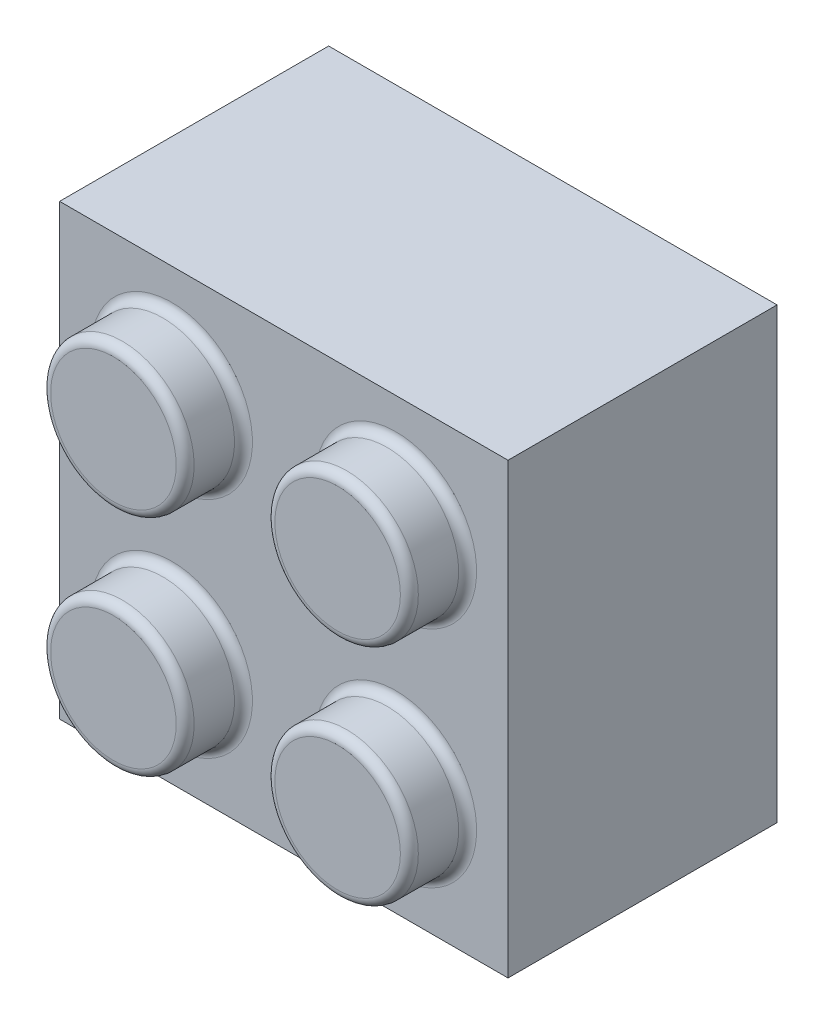
ISO-10303-21;
HEADER;
FILE_DESCRIPTION(('STEP AP214'),'2;1');
FILE_NAME('part.step','',(''),(''),'','','');
FILE_SCHEMA(('AUTOMOTIVE_DESIGN { 1 0 10303 214 1 1 1 1 }'));
ENDSEC;
DATA;
#1=APPLICATION_CONTEXT('core data for automotive mechanical design processes');
#2=APPLICATION_PROTOCOL_DEFINITION('international standard','automotive_design',2000,#1);
#3=PRODUCT_CONTEXT('',#1,'mechanical');
#4=PRODUCT('Part','Part','',(#3));
#5=PRODUCT_RELATED_PRODUCT_CATEGORY('part','',(#4));
#6=PRODUCT_DEFINITION_FORMATION('','',#4);
#7=PRODUCT_DEFINITION_CONTEXT('part definition',#1,'design');
#8=PRODUCT_DEFINITION('design','',#6,#7);
#9=PRODUCT_DEFINITION_SHAPE('','',#8);
#10=(LENGTH_UNIT() NAMED_UNIT(*) SI_UNIT(.MILLI.,.METRE.));
#11=(NAMED_UNIT(*) PLANE_ANGLE_UNIT() SI_UNIT($,.RADIAN.));
#12=(NAMED_UNIT(*) SI_UNIT($,.STERADIAN.) SOLID_ANGLE_UNIT());
#13=UNCERTAINTY_MEASURE_WITH_UNIT(LENGTH_MEASURE(1.E-05),#10,'distance_accuracy_value','');
#14=(GEOMETRIC_REPRESENTATION_CONTEXT(3) GLOBAL_UNCERTAINTY_ASSIGNED_CONTEXT((#13)) GLOBAL_UNIT_ASSIGNED_CONTEXT((#10,
#11,#12)) REPRESENTATION_CONTEXT('',''));
#15=CARTESIAN_POINT('',(0.,0.,0.));
#16=DIRECTION('',(0.,0.,1.));
#17=DIRECTION('',(1.,0.,0.));
#18=AXIS2_PLACEMENT_3D('',#15,#16,#17);
#19=CARTESIAN_POINT('',(0.,0.,0.));
#20=DIRECTION('',(0.,0.,-1.));
#21=DIRECTION('',(-1.,0.,0.));
#22=AXIS2_PLACEMENT_3D('',#19,#20,#21);
#23=PLANE('',#22);
#24=DIRECTION('',(-1.,0.,0.));
#25=VECTOR('',#24,1.);
#26=CARTESIAN_POINT('',(50.,-50.,0.));
#27=LINE('',#26,#25);
#28=CARTESIAN_POINT('',(50.,-50.,0.));
#29=VERTEX_POINT('',#28);
#30=CARTESIAN_POINT('',(-50.,-50.,0.));
#31=VERTEX_POINT('',#30);
#32=EDGE_CURVE('E177',#29,#31,#27,.T.);
#33=ORIENTED_EDGE('',*,*,#32,.T.);
#34=DIRECTION('',(0.,1.,0.));
#35=VECTOR('',#34,1.);
#36=CARTESIAN_POINT('',(-50.,-50.,0.));
#37=LINE('',#36,#35);
#38=CARTESIAN_POINT('',(-50.,50.,0.));
#39=VERTEX_POINT('',#38);
#40=EDGE_CURVE('E200',#31,#39,#37,.T.);
#41=ORIENTED_EDGE('',*,*,#40,.T.);
#42=DIRECTION('',(1.,0.,0.));
#43=VECTOR('',#42,1.);
#44=CARTESIAN_POINT('',(-50.,50.,0.));
#45=LINE('',#44,#43);
#46=CARTESIAN_POINT('',(50.,50.,0.));
#47=VERTEX_POINT('',#46);
#48=EDGE_CURVE('E204',#39,#47,#45,.T.);
#49=ORIENTED_EDGE('',*,*,#48,.T.);
#50=DIRECTION('',(0.,-1.,0.));
#51=VECTOR('',#50,1.);
#52=CARTESIAN_POINT('',(50.,50.,0.));
#53=LINE('',#52,#51);
#54=EDGE_CURVE('E187',#47,#29,#53,.T.);
#55=ORIENTED_EDGE('',*,*,#54,.T.);
#56=EDGE_LOOP('',(#33,#41,#49,#55));
#57=FACE_BOUND('',#56,.T.);
#58=DIRECTION('',(1.,0.,0.));
#59=VECTOR('',#58,1.);
#60=CARTESIAN_POINT('',(0.,-42.,0.));
#61=LINE('',#60,#59);
#62=CARTESIAN_POINT('',(-42.,-42.,0.));
#63=VERTEX_POINT('',#62);
#64=CARTESIAN_POINT('',(42.,-42.,0.));
#65=VERTEX_POINT('',#64);
#66=EDGE_CURVE('E168',#63,#65,#61,.T.);
#67=ORIENTED_EDGE('',*,*,#66,.T.);
#68=DIRECTION('',(0.,1.,0.));
#69=VECTOR('',#68,1.);
#70=CARTESIAN_POINT('',(42.,0.,0.));
#71=LINE('',#70,#69);
#72=CARTESIAN_POINT('',(42.,42.,0.));
#73=VERTEX_POINT('',#72);
#74=EDGE_CURVE('E71',#65,#73,#71,.T.);
#75=ORIENTED_EDGE('',*,*,#74,.T.);
#76=DIRECTION('',(-1.,0.,0.));
#77=VECTOR('',#76,1.);
#78=CARTESIAN_POINT('',(0.,42.,0.));
#79=LINE('',#78,#77);
#80=CARTESIAN_POINT('',(-42.,42.,0.));
#81=VERTEX_POINT('',#80);
#82=EDGE_CURVE('E153',#73,#81,#79,.T.);
#83=ORIENTED_EDGE('',*,*,#82,.T.);
#84=DIRECTION('',(0.,-1.,0.));
#85=VECTOR('',#84,1.);
#86=CARTESIAN_POINT('',(-42.,0.,0.));
#87=LINE('',#86,#85);
#88=EDGE_CURVE('E157',#81,#63,#87,.T.);
#89=ORIENTED_EDGE('',*,*,#88,.T.);
#90=EDGE_LOOP('',(#67,#75,#83,#89));
#91=FACE_BOUND('',#90,.T.);
#92=ADVANCED_FACE('F55',(#57,#91),#23,.T.);
#93=CARTESIAN_POINT('',(50.,-50.,60.));
#94=DIRECTION('',(0.,-1.,0.));
#95=DIRECTION('',(0.,0.,-1.));
#96=AXIS2_PLACEMENT_3D('',#93,#94,#95);
#97=PLANE('',#96);
#98=ORIENTED_EDGE('',*,*,#32,.F.);
#99=DIRECTION('',(0.,0.,-1.));
#100=VECTOR('',#99,1.);
#101=CARTESIAN_POINT('',(50.,-50.,60.));
#102=LINE('',#101,#100);
#103=CARTESIAN_POINT('',(50.,-50.,60.));
#104=VERTEX_POINT('',#103);
#105=EDGE_CURVE('E80',#104,#29,#102,.T.);
#106=ORIENTED_EDGE('',*,*,#105,.F.);
#107=DIRECTION('',(-1.,0.,0.));
#108=VECTOR('',#107,1.);
#109=CARTESIAN_POINT('',(50.,-50.,60.));
#110=LINE('',#109,#108);
#111=CARTESIAN_POINT('',(-50.,-50.,60.));
#112=VERTEX_POINT('',#111);
#113=EDGE_CURVE('E183',#104,#112,#110,.T.);
#114=ORIENTED_EDGE('',*,*,#113,.T.);
#115=DIRECTION('',(0.,0.,-1.));
#116=VECTOR('',#115,1.);
#117=CARTESIAN_POINT('',(-50.,-50.,60.));
#118=LINE('',#117,#116);
#119=EDGE_CURVE('E106',#112,#31,#118,.T.);
#120=ORIENTED_EDGE('',*,*,#119,.T.);
#121=EDGE_LOOP('',(#98,#106,#114,#120));
#122=FACE_BOUND('',#121,.T.);
#123=ADVANCED_FACE('F330',(#122),#97,.T.);
#124=CARTESIAN_POINT('',(50.,50.,60.));
#125=DIRECTION('',(1.,0.,0.));
#126=DIRECTION('',(0.,0.,-1.));
#127=AXIS2_PLACEMENT_3D('',#124,#125,#126);
#128=PLANE('',#127);
#129=ORIENTED_EDGE('',*,*,#54,.F.);
#130=DIRECTION('',(0.,0.,-1.));
#131=VECTOR('',#130,1.);
#132=CARTESIAN_POINT('',(50.,50.,60.));
#133=LINE('',#132,#131);
#134=CARTESIAN_POINT('',(50.,50.,60.));
#135=VERTEX_POINT('',#134);
#136=EDGE_CURVE('E214',#135,#47,#133,.T.);
#137=ORIENTED_EDGE('',*,*,#136,.F.);
#138=DIRECTION('',(0.,-1.,0.));
#139=VECTOR('',#138,1.);
#140=CARTESIAN_POINT('',(50.,50.,60.));
#141=LINE('',#140,#139);
#142=EDGE_CURVE('E194',#135,#104,#141,.T.);
#143=ORIENTED_EDGE('',*,*,#142,.T.);
#144=ORIENTED_EDGE('',*,*,#105,.T.);
#145=EDGE_LOOP('',(#129,#137,#143,#144));
#146=FACE_BOUND('',#145,.T.);
#147=ADVANCED_FACE('F335',(#146),#128,.T.);
#148=CARTESIAN_POINT('',(-50.,50.,60.));
#149=DIRECTION('',(0.,1.,0.));
#150=DIRECTION('',(0.,0.,1.));
#151=AXIS2_PLACEMENT_3D('',#148,#149,#150);
#152=PLANE('',#151);
#153=ORIENTED_EDGE('',*,*,#48,.F.);
#154=DIRECTION('',(0.,0.,-1.));
#155=VECTOR('',#154,1.);
#156=CARTESIAN_POINT('',(-50.,50.,60.));
#157=LINE('',#156,#155);
#158=CARTESIAN_POINT('',(-50.,50.,60.));
#159=VERTEX_POINT('',#158);
#160=EDGE_CURVE('E217',#159,#39,#157,.T.);
#161=ORIENTED_EDGE('',*,*,#160,.F.);
#162=DIRECTION('',(1.,0.,0.));
#163=VECTOR('',#162,1.);
#164=CARTESIAN_POINT('',(-50.,50.,60.));
#165=LINE('',#164,#163);
#166=EDGE_CURVE('E190',#159,#135,#165,.T.);
#167=ORIENTED_EDGE('',*,*,#166,.T.);
#168=ORIENTED_EDGE('',*,*,#136,.T.);
#169=EDGE_LOOP('',(#153,#161,#167,#168));
#170=FACE_BOUND('',#169,.T.);
#171=ADVANCED_FACE('F396',(#170),#152,.T.);
#172=CARTESIAN_POINT('',(-50.,-50.,60.));
#173=DIRECTION('',(-1.,0.,0.));
#174=DIRECTION('',(0.,0.,1.));
#175=AXIS2_PLACEMENT_3D('',#172,#173,#174);
#176=PLANE('',#175);
#177=ORIENTED_EDGE('',*,*,#40,.F.);
#178=ORIENTED_EDGE('',*,*,#119,.F.);
#179=DIRECTION('',(0.,1.,0.));
#180=VECTOR('',#179,1.);
#181=CARTESIAN_POINT('',(-50.,-50.,60.));
#182=LINE('',#181,#180);
#183=EDGE_CURVE('E186',#112,#159,#182,.T.);
#184=ORIENTED_EDGE('',*,*,#183,.T.);
#185=ORIENTED_EDGE('',*,*,#160,.T.);
#186=EDGE_LOOP('',(#177,#178,#184,#185));
#187=FACE_BOUND('',#186,.T.);
#188=ADVANCED_FACE('F390',(#187),#176,.T.);
#189=CARTESIAN_POINT('',(0.,0.,60.));
#190=DIRECTION('',(0.,0.,-1.));
#191=DIRECTION('',(-1.,0.,0.));
#192=AXIS2_PLACEMENT_3D('',#189,#190,#191);
#193=PLANE('',#192);
#194=CARTESIAN_POINT('',(25.,-25.,60.));
#195=DIRECTION('',(0.,0.,-1.));
#196=DIRECTION('',(-1.,0.,0.));
#197=AXIS2_PLACEMENT_3D('',#194,#195,#196);
#198=CIRCLE('',#197,18.);
#199=CARTESIAN_POINT('',(7.00000000000001,-25.,60.));
#200=VERTEX_POINT('',#199);
#201=EDGE_CURVE('E265',#200,#200,#198,.T.);
#202=ORIENTED_EDGE('',*,*,#201,.T.);
#203=EDGE_LOOP('',(#202));
#204=FACE_BOUND('',#203,.T.);
#205=CARTESIAN_POINT('',(-25.,-25.,60.));
#206=DIRECTION('',(0.,0.,-1.));
#207=DIRECTION('',(-1.,0.,0.));
#208=AXIS2_PLACEMENT_3D('',#205,#206,#207);
#209=CIRCLE('',#208,18.);
#210=CARTESIAN_POINT('',(-43.,-25.,60.));
#211=VERTEX_POINT('',#210);
#212=EDGE_CURVE('E261',#211,#211,#209,.T.);
#213=ORIENTED_EDGE('',*,*,#212,.T.);
#214=EDGE_LOOP('',(#213));
#215=FACE_BOUND('',#214,.T.);
#216=CARTESIAN_POINT('',(25.,25.,60.));
#217=DIRECTION('',(0.,0.,-1.));
#218=DIRECTION('',(-1.,0.,0.));
#219=AXIS2_PLACEMENT_3D('',#216,#217,#218);
#220=CIRCLE('',#219,18.);
#221=CARTESIAN_POINT('',(7.,25.,60.));
#222=VERTEX_POINT('',#221);
#223=EDGE_CURVE('E257',#222,#222,#220,.T.);
#224=ORIENTED_EDGE('',*,*,#223,.T.);
#225=EDGE_LOOP('',(#224));
#226=FACE_BOUND('',#225,.T.);
#227=CARTESIAN_POINT('',(-25.,25.,60.));
#228=DIRECTION('',(0.,0.,-1.));
#229=DIRECTION('',(-1.,0.,0.));
#230=AXIS2_PLACEMENT_3D('',#227,#228,#229);
#231=CIRCLE('',#230,18.);
#232=CARTESIAN_POINT('',(-43.,25.,60.));
#233=VERTEX_POINT('',#232);
#234=EDGE_CURVE('E253',#233,#233,#231,.T.);
#235=ORIENTED_EDGE('',*,*,#234,.T.);
#236=EDGE_LOOP('',(#235));
#237=FACE_BOUND('',#236,.T.);
#238=ORIENTED_EDGE('',*,*,#113,.F.);
#239=ORIENTED_EDGE('',*,*,#142,.F.);
#240=ORIENTED_EDGE('',*,*,#166,.F.);
#241=ORIENTED_EDGE('',*,*,#183,.F.);
#242=EDGE_LOOP('',(#238,#239,#240,#241));
#243=FACE_BOUND('',#242,.T.);
#244=ADVANCED_FACE('F387',(#204,#215,#226,#237,#243),#193,.F.);
#245=CARTESIAN_POINT('',(25.,25.,73.));
#246=DIRECTION('',(0.,0.,-1.));
#247=DIRECTION('',(-1.,0.,0.));
#248=AXIS2_PLACEMENT_3D('',#245,#246,#247);
#249=CYLINDRICAL_SURFACE('',#248,16.);
#250=CARTESIAN_POINT('',(25.,25.,62.));
#251=DIRECTION('',(0.,0.,-1.));
#252=DIRECTION('',(-1.,0.,0.));
#253=AXIS2_PLACEMENT_3D('',#250,#251,#252);
#254=CIRCLE('',#253,16.);
#255=CARTESIAN_POINT('',(9.,25.,62.));
#256=VERTEX_POINT('',#255);
#257=EDGE_CURVE('E277',#256,#256,#254,.F.);
#258=CARTESIAN_POINT('',(25.,25.,71.));
#259=DIRECTION('',(0.,0.,1.));
#260=DIRECTION('',(1.,0.,0.));
#261=AXIS2_PLACEMENT_3D('',#258,#259,#260);
#262=CIRCLE('',#261,16.);
#263=CARTESIAN_POINT('',(9.,25.,71.));
#264=VERTEX_POINT('',#263);
#265=EDGE_CURVE('E273',#264,#264,#262,.F.);
#266=CARTESIAN_POINT('',(9.,25.,62.));
#267=CARTESIAN_POINT('',(9.,25.,62.09375));
#268=CARTESIAN_POINT('',(9.,25.,62.1875));
#269=CARTESIAN_POINT('',(9.,25.,62.375));
#270=CARTESIAN_POINT('',(9.,25.,62.46875));
#271=CARTESIAN_POINT('',(9.,25.,62.65625));
#272=CARTESIAN_POINT('',(9.,25.,62.75));
#273=CARTESIAN_POINT('',(9.,25.,62.9375));
#274=CARTESIAN_POINT('',(9.,25.,63.03125));
#275=CARTESIAN_POINT('',(9.,25.,63.21875));
#276=CARTESIAN_POINT('',(9.,25.,63.3125));
#277=CARTESIAN_POINT('',(9.,25.,63.5));
#278=CARTESIAN_POINT('',(9.,25.,63.59375));
#279=CARTESIAN_POINT('',(9.,25.,63.78125));
#280=CARTESIAN_POINT('',(9.,25.,63.875));
#281=CARTESIAN_POINT('',(9.,25.,64.0625));
#282=CARTESIAN_POINT('',(9.,25.,64.15625));
#283=CARTESIAN_POINT('',(9.,25.,64.34375));
#284=CARTESIAN_POINT('',(9.,25.,64.4375));
#285=CARTESIAN_POINT('',(9.,25.,64.625));
#286=CARTESIAN_POINT('',(9.,25.,64.71875));
#287=CARTESIAN_POINT('',(9.,25.,64.90625));
#288=CARTESIAN_POINT('',(9.,25.,65.));
#289=CARTESIAN_POINT('',(9.,25.,65.1875));
#290=CARTESIAN_POINT('',(9.,25.,65.28125));
#291=CARTESIAN_POINT('',(9.,25.,65.46875));
#292=CARTESIAN_POINT('',(9.,25.,65.5625));
#293=CARTESIAN_POINT('',(9.,25.,65.75));
#294=CARTESIAN_POINT('',(9.,25.,65.84375));
#295=CARTESIAN_POINT('',(9.,25.,66.03125));
#296=CARTESIAN_POINT('',(9.,25.,66.125));
#297=CARTESIAN_POINT('',(9.,25.,66.3125));
#298=CARTESIAN_POINT('',(9.,25.,66.40625));
#299=CARTESIAN_POINT('',(9.,25.,66.59375));
#300=CARTESIAN_POINT('',(9.,25.,66.6875));
#301=CARTESIAN_POINT('',(9.,25.,66.875));
#302=CARTESIAN_POINT('',(9.,25.,66.96875));
#303=CARTESIAN_POINT('',(9.,25.,67.15625));
#304=CARTESIAN_POINT('',(9.,25.,67.25));
#305=CARTESIAN_POINT('',(9.,25.,67.4375));
#306=CARTESIAN_POINT('',(9.,25.,67.53125));
#307=CARTESIAN_POINT('',(9.,25.,67.71875));
#308=CARTESIAN_POINT('',(9.,25.,67.8125));
#309=CARTESIAN_POINT('',(9.,25.,68.));
#310=CARTESIAN_POINT('',(9.,25.,68.09375));
#311=CARTESIAN_POINT('',(9.,25.,68.28125));
#312=CARTESIAN_POINT('',(9.,25.,68.375));
#313=CARTESIAN_POINT('',(9.,25.,68.5625));
#314=CARTESIAN_POINT('',(9.,25.,68.65625));
#315=CARTESIAN_POINT('',(9.,25.,68.84375));
#316=CARTESIAN_POINT('',(9.,25.,68.9375));
#317=CARTESIAN_POINT('',(9.,25.,69.125));
#318=CARTESIAN_POINT('',(9.,25.,69.21875));
#319=CARTESIAN_POINT('',(9.,25.,69.40625));
#320=CARTESIAN_POINT('',(9.,25.,69.5));
#321=CARTESIAN_POINT('',(9.,25.,69.6875));
#322=CARTESIAN_POINT('',(9.,25.,69.78125));
#323=CARTESIAN_POINT('',(9.,25.,69.96875));
#324=CARTESIAN_POINT('',(9.,25.,70.0625));
#325=CARTESIAN_POINT('',(9.,25.,70.25));
#326=CARTESIAN_POINT('',(9.,25.,70.34375));
#327=CARTESIAN_POINT('',(9.,25.,70.53125));
#328=CARTESIAN_POINT('',(9.,25.,70.625));
#329=CARTESIAN_POINT('',(9.,25.,70.8125));
#330=CARTESIAN_POINT('',(9.,25.,70.90625));
#331=CARTESIAN_POINT('',(9.,25.,71.));
#332=B_SPLINE_CURVE_WITH_KNOTS('',3,(#266,#267,#268,#269,#270,#271,#272,#273,#274,#275,#276,
#277,#278,#279,#280,#281,#282,#283,#284,#285,#286,#287,#288,#289,#290,#291,#292,#293,#294,#295,
#296,#297,#298,#299,#300,#301,#302,#303,#304,#305,#306,#307,#308,#309,#310,#311,#312,#313,#314,
#315,#316,#317,#318,#319,#320,#321,#322,#323,#324,#325,#326,#327,#328,#329,#330,#331),
.UNSPECIFIED.,.F.,.F.,(4,2,2,2,2,2,2,2,2,2,2,2,2,2,2,2,2,2,2,2,2,2,2,2,2,2,2,2,2,2,2,2,4),(0.,
0.281249999999997,0.5625,0.843749999999997,1.12499999999999,1.40624999999999,1.6875,1.96875,
2.25,2.53124999999999,2.81249999999999,3.09375,3.375,3.65624999999999,3.93749999999999,
4.21874999999999,4.49999999999998,4.78124999999999,5.06249999999999,5.34374999999999,
5.62499999999998,5.90624999999998,6.18749999999999,6.46874999999999,6.74999999999998,
7.03124999999998,7.31249999999998,7.59374999999999,7.87499999999999,8.15624999999998,
8.43749999999998,8.71874999999998,8.99999999999999),.UNSPECIFIED.);
#333=EDGE_CURVE('BSEAM384',#256,#264,#332,.T.);
#334=ORIENTED_EDGE('',*,*,#257,.T.);
#335=ORIENTED_EDGE('',*,*,#265,.T.);
#336=ORIENTED_EDGE('',*,*,#333,.T.);
#337=ORIENTED_EDGE('',*,*,#333,.F.);
#338=EDGE_LOOP('',(#334,#336,#335,#337));
#339=FACE_BOUND('',#338,.T.);
#340=ADVANCED_FACE('F384',(#339),#249,.T.);
#341=CARTESIAN_POINT('',(0.,0.,73.));
#342=DIRECTION('',(0.,0.,1.));
#343=DIRECTION('',(1.,0.,0.));
#344=AXIS2_PLACEMENT_3D('',#341,#342,#343);
#345=PLANE('',#344);
#346=CARTESIAN_POINT('',(25.,25.,73.));
#347=DIRECTION('',(0.,0.,1.));
#348=DIRECTION('',(1.,0.,0.));
#349=AXIS2_PLACEMENT_3D('',#346,#347,#348);
#350=CIRCLE('',#349,14.);
#351=CARTESIAN_POINT('',(39.,25.,73.));
#352=VERTEX_POINT('',#351);
#353=EDGE_CURVE('E281',#352,#352,#350,.T.);
#354=ORIENTED_EDGE('',*,*,#353,.T.);
#355=EDGE_LOOP('',(#354));
#356=FACE_BOUND('',#355,.T.);
#357=ADVANCED_FACE('F377',(#356),#345,.T.);
#358=CARTESIAN_POINT('',(-25.,-25.,73.));
#359=DIRECTION('',(0.,0.,-1.));
#360=DIRECTION('',(-1.,0.,0.));
#361=AXIS2_PLACEMENT_3D('',#358,#359,#360);
#362=CYLINDRICAL_SURFACE('',#361,16.);
#363=CARTESIAN_POINT('',(-25.,-25.,71.));
#364=DIRECTION('',(0.,0.,1.));
#365=DIRECTION('',(1.,0.,0.));
#366=AXIS2_PLACEMENT_3D('',#363,#364,#365);
#367=CIRCLE('',#366,16.);
#368=CARTESIAN_POINT('',(-41.,-25.,71.));
#369=VERTEX_POINT('',#368);
#370=EDGE_CURVE('E229',#369,#369,#367,.F.);
#371=CARTESIAN_POINT('',(-25.,-25.,62.));
#372=DIRECTION('',(0.,0.,-1.));
#373=DIRECTION('',(-1.,0.,0.));
#374=AXIS2_PLACEMENT_3D('',#371,#372,#373);
#375=CIRCLE('',#374,16.);
#376=CARTESIAN_POINT('',(-41.,-25.,62.));
#377=VERTEX_POINT('',#376);
#378=EDGE_CURVE('E225',#377,#377,#375,.F.);
#379=CARTESIAN_POINT('',(-41.,-25.,71.));
#380=CARTESIAN_POINT('',(-41.,-25.,70.90625));
#381=CARTESIAN_POINT('',(-41.,-25.,70.8125));
#382=CARTESIAN_POINT('',(-41.,-25.,70.625));
#383=CARTESIAN_POINT('',(-41.,-25.,70.53125));
#384=CARTESIAN_POINT('',(-41.,-25.,70.34375));
#385=CARTESIAN_POINT('',(-41.,-25.,70.25));
#386=CARTESIAN_POINT('',(-41.,-25.,70.0625));
#387=CARTESIAN_POINT('',(-41.,-25.,69.96875));
#388=CARTESIAN_POINT('',(-41.,-25.,69.78125));
#389=CARTESIAN_POINT('',(-41.,-25.,69.6875));
#390=CARTESIAN_POINT('',(-41.,-25.,69.5));
#391=CARTESIAN_POINT('',(-41.,-25.,69.40625));
#392=CARTESIAN_POINT('',(-41.,-25.,69.21875));
#393=CARTESIAN_POINT('',(-41.,-25.,69.125));
#394=CARTESIAN_POINT('',(-41.,-25.,68.9375));
#395=CARTESIAN_POINT('',(-41.,-25.,68.84375));
#396=CARTESIAN_POINT('',(-41.,-25.,68.65625));
#397=CARTESIAN_POINT('',(-41.,-25.,68.5625));
#398=CARTESIAN_POINT('',(-41.,-25.,68.375));
#399=CARTESIAN_POINT('',(-41.,-25.,68.28125));
#400=CARTESIAN_POINT('',(-41.,-25.,68.09375));
#401=CARTESIAN_POINT('',(-41.,-25.,68.));
#402=CARTESIAN_POINT('',(-41.,-25.,67.8125));
#403=CARTESIAN_POINT('',(-41.,-25.,67.71875));
#404=CARTESIAN_POINT('',(-41.,-25.,67.53125));
#405=CARTESIAN_POINT('',(-41.,-25.,67.4375));
#406=CARTESIAN_POINT('',(-41.,-25.,67.25));
#407=CARTESIAN_POINT('',(-41.,-25.,67.15625));
#408=CARTESIAN_POINT('',(-41.,-25.,66.96875));
#409=CARTESIAN_POINT('',(-41.,-25.,66.875));
#410=CARTESIAN_POINT('',(-41.,-25.,66.6875));
#411=CARTESIAN_POINT('',(-41.,-25.,66.59375));
#412=CARTESIAN_POINT('',(-41.,-25.,66.40625));
#413=CARTESIAN_POINT('',(-41.,-25.,66.3125));
#414=CARTESIAN_POINT('',(-41.,-25.,66.125));
#415=CARTESIAN_POINT('',(-41.,-25.,66.03125));
#416=CARTESIAN_POINT('',(-41.,-25.,65.84375));
#417=CARTESIAN_POINT('',(-41.,-25.,65.75));
#418=CARTESIAN_POINT('',(-41.,-25.,65.5625));
#419=CARTESIAN_POINT('',(-41.,-25.,65.46875));
#420=CARTESIAN_POINT('',(-41.,-25.,65.28125));
#421=CARTESIAN_POINT('',(-41.,-25.,65.1875));
#422=CARTESIAN_POINT('',(-41.,-25.,65.));
#423=CARTESIAN_POINT('',(-41.,-25.,64.90625));
#424=CARTESIAN_POINT('',(-41.,-25.,64.71875));
#425=CARTESIAN_POINT('',(-41.,-25.,64.625));
#426=CARTESIAN_POINT('',(-41.,-25.,64.4375));
#427=CARTESIAN_POINT('',(-41.,-25.,64.34375));
#428=CARTESIAN_POINT('',(-41.,-25.,64.15625));
#429=CARTESIAN_POINT('',(-41.,-25.,64.0625));
#430=CARTESIAN_POINT('',(-41.,-25.,63.875));
#431=CARTESIAN_POINT('',(-41.,-25.,63.78125));
#432=CARTESIAN_POINT('',(-41.,-25.,63.59375));
#433=CARTESIAN_POINT('',(-41.,-25.,63.5));
#434=CARTESIAN_POINT('',(-41.,-25.,63.3125));
#435=CARTESIAN_POINT('',(-41.,-25.,63.21875));
#436=CARTESIAN_POINT('',(-41.,-25.,63.03125));
#437=CARTESIAN_POINT('',(-41.,-25.,62.9375));
#438=CARTESIAN_POINT('',(-41.,-25.,62.75));
#439=CARTESIAN_POINT('',(-41.,-25.,62.65625));
#440=CARTESIAN_POINT('',(-41.,-25.,62.46875));
#441=CARTESIAN_POINT('',(-41.,-25.,62.375));
#442=CARTESIAN_POINT('',(-41.,-25.,62.1875));
#443=CARTESIAN_POINT('',(-41.,-25.,62.09375));
#444=CARTESIAN_POINT('',(-41.,-25.,62.));
#445=B_SPLINE_CURVE_WITH_KNOTS('',3,(#379,#380,#381,#382,#383,#384,#385,#386,#387,#388,#389,
#390,#391,#392,#393,#394,#395,#396,#397,#398,#399,#400,#401,#402,#403,#404,#405,#406,#407,#408,
#409,#410,#411,#412,#413,#414,#415,#416,#417,#418,#419,#420,#421,#422,#423,#424,#425,#426,#427,
#428,#429,#430,#431,#432,#433,#434,#435,#436,#437,#438,#439,#440,#441,#442,#443,#444),
.UNSPECIFIED.,.F.,.F.,(4,2,2,2,2,2,2,2,2,2,2,2,2,2,2,2,2,2,2,2,2,2,2,2,2,2,2,2,2,2,2,2,4),(0.,
0.281250000000011,0.562500000000007,0.843750000000004,1.125,1.40625,1.68750000000001,
1.96875000000001,2.25,2.53125,2.8125,3.09375000000001,3.375,3.65625,3.9375,4.21874999999999,4.5,
4.78125,5.0625,5.34374999999999,5.62499999999999,5.90624999999999,6.1875,6.46875,
6.74999999999999,7.03124999999999,7.31249999999999,7.59375,7.87499999999999,8.15624999999999,
8.43749999999999,8.71874999999999,8.99999999999999),.UNSPECIFIED.);
#446=EDGE_CURVE('BSEAM374',#369,#377,#445,.T.);
#447=ORIENTED_EDGE('',*,*,#370,.T.);
#448=ORIENTED_EDGE('',*,*,#378,.T.);
#449=ORIENTED_EDGE('',*,*,#446,.T.);
#450=ORIENTED_EDGE('',*,*,#446,.F.);
#451=EDGE_LOOP('',(#447,#449,#448,#450));
#452=FACE_BOUND('',#451,.T.);
#453=ADVANCED_FACE('F374',(#452),#362,.T.);
#454=CARTESIAN_POINT('',(0.,0.,73.));
#455=DIRECTION('',(0.,0.,1.));
#456=DIRECTION('',(1.,0.,0.));
#457=AXIS2_PLACEMENT_3D('',#454,#455,#456);
#458=PLANE('',#457);
#459=CARTESIAN_POINT('',(-25.,-25.,73.));
#460=DIRECTION('',(0.,0.,1.));
#461=DIRECTION('',(1.,0.,0.));
#462=AXIS2_PLACEMENT_3D('',#459,#460,#461);
#463=CIRCLE('',#462,14.);
#464=CARTESIAN_POINT('',(-11.,-25.,73.));
#465=VERTEX_POINT('',#464);
#466=EDGE_CURVE('E213',#465,#465,#463,.T.);
#467=ORIENTED_EDGE('',*,*,#466,.T.);
#468=EDGE_LOOP('',(#467));
#469=FACE_BOUND('',#468,.T.);
#470=ADVANCED_FACE('F369',(#469),#458,.T.);
#471=CARTESIAN_POINT('',(25.,-25.,73.));
#472=DIRECTION('',(0.,0.,-1.));
#473=DIRECTION('',(-1.,0.,0.));
#474=AXIS2_PLACEMENT_3D('',#471,#472,#473);
#475=CYLINDRICAL_SURFACE('',#474,16.);
#476=CARTESIAN_POINT('',(25.,-25.,62.));
#477=DIRECTION('',(0.,0.,-1.));
#478=DIRECTION('',(-1.,0.,0.));
#479=AXIS2_PLACEMENT_3D('',#476,#477,#478);
#480=CIRCLE('',#479,16.);
#481=CARTESIAN_POINT('',(9.00000000000001,-25.,62.));
#482=VERTEX_POINT('',#481);
#483=EDGE_CURVE('E249',#482,#482,#480,.F.);
#484=CARTESIAN_POINT('',(25.,-25.,71.));
#485=DIRECTION('',(0.,0.,1.));
#486=DIRECTION('',(1.,0.,0.));
#487=AXIS2_PLACEMENT_3D('',#484,#485,#486);
#488=CIRCLE('',#487,16.);
#489=CARTESIAN_POINT('',(9.00000000000001,-25.,71.));
#490=VERTEX_POINT('',#489);
#491=EDGE_CURVE('E245',#490,#490,#488,.F.);
#492=CARTESIAN_POINT('',(9.00000000000001,-25.,62.));
#493=CARTESIAN_POINT('',(9.00000000000001,-25.,62.09375));
#494=CARTESIAN_POINT('',(9.00000000000001,-25.,62.1875));
#495=CARTESIAN_POINT('',(9.00000000000001,-25.,62.375));
#496=CARTESIAN_POINT('',(9.00000000000001,-25.,62.46875));
#497=CARTESIAN_POINT('',(9.00000000000001,-25.,62.65625));
#498=CARTESIAN_POINT('',(9.00000000000001,-25.,62.75));
#499=CARTESIAN_POINT('',(9.00000000000001,-25.,62.9375));
#500=CARTESIAN_POINT('',(9.00000000000001,-25.,63.03125));
#501=CARTESIAN_POINT('',(9.00000000000001,-25.,63.21875));
#502=CARTESIAN_POINT('',(9.00000000000001,-25.,63.3125));
#503=CARTESIAN_POINT('',(9.00000000000001,-25.,63.5));
#504=CARTESIAN_POINT('',(9.00000000000001,-25.,63.59375));
#505=CARTESIAN_POINT('',(9.00000000000001,-25.,63.78125));
#506=CARTESIAN_POINT('',(9.00000000000001,-25.,63.875));
#507=CARTESIAN_POINT('',(9.00000000000001,-25.,64.0625));
#508=CARTESIAN_POINT('',(9.00000000000001,-25.,64.15625));
#509=CARTESIAN_POINT('',(9.00000000000001,-25.,64.34375));
#510=CARTESIAN_POINT('',(9.00000000000001,-25.,64.4375));
#511=CARTESIAN_POINT('',(9.00000000000001,-25.,64.625));
#512=CARTESIAN_POINT('',(9.00000000000001,-25.,64.71875));
#513=CARTESIAN_POINT('',(9.00000000000001,-25.,64.90625));
#514=CARTESIAN_POINT('',(9.00000000000001,-25.,65.));
#515=CARTESIAN_POINT('',(9.00000000000001,-25.,65.1875));
#516=CARTESIAN_POINT('',(9.00000000000001,-25.,65.28125));
#517=CARTESIAN_POINT('',(9.00000000000001,-25.,65.46875));
#518=CARTESIAN_POINT('',(9.00000000000001,-25.,65.5625));
#519=CARTESIAN_POINT('',(9.00000000000001,-25.,65.75));
#520=CARTESIAN_POINT('',(9.00000000000001,-25.,65.84375));
#521=CARTESIAN_POINT('',(9.00000000000001,-25.,66.03125));
#522=CARTESIAN_POINT('',(9.00000000000001,-25.,66.125));
#523=CARTESIAN_POINT('',(9.00000000000001,-25.,66.3125));
#524=CARTESIAN_POINT('',(9.00000000000001,-25.,66.40625));
#525=CARTESIAN_POINT('',(9.00000000000001,-25.,66.59375));
#526=CARTESIAN_POINT('',(9.00000000000001,-25.,66.6875));
#527=CARTESIAN_POINT('',(9.00000000000001,-25.,66.875));
#528=CARTESIAN_POINT('',(9.00000000000001,-25.,66.96875));
#529=CARTESIAN_POINT('',(9.00000000000001,-25.,67.15625));
#530=CARTESIAN_POINT('',(9.00000000000001,-25.,67.25));
#531=CARTESIAN_POINT('',(9.00000000000001,-25.,67.4375));
#532=CARTESIAN_POINT('',(9.00000000000001,-25.,67.53125));
#533=CARTESIAN_POINT('',(9.00000000000001,-25.,67.71875));
#534=CARTESIAN_POINT('',(9.00000000000001,-25.,67.8125));
#535=CARTESIAN_POINT('',(9.00000000000001,-25.,68.));
#536=CARTESIAN_POINT('',(9.00000000000001,-25.,68.09375));
#537=CARTESIAN_POINT('',(9.00000000000001,-25.,68.28125));
#538=CARTESIAN_POINT('',(9.00000000000001,-25.,68.375));
#539=CARTESIAN_POINT('',(9.00000000000001,-25.,68.5625));
#540=CARTESIAN_POINT('',(9.00000000000001,-25.,68.65625));
#541=CARTESIAN_POINT('',(9.00000000000001,-25.,68.84375));
#542=CARTESIAN_POINT('',(9.00000000000001,-25.,68.9375));
#543=CARTESIAN_POINT('',(9.00000000000001,-25.,69.125));
#544=CARTESIAN_POINT('',(9.00000000000001,-25.,69.21875));
#545=CARTESIAN_POINT('',(9.00000000000001,-25.,69.40625));
#546=CARTESIAN_POINT('',(9.00000000000001,-25.,69.5));
#547=CARTESIAN_POINT('',(9.00000000000001,-25.,69.6875));
#548=CARTESIAN_POINT('',(9.00000000000001,-25.,69.78125));
#549=CARTESIAN_POINT('',(9.00000000000001,-25.,69.96875));
#550=CARTESIAN_POINT('',(9.00000000000001,-25.,70.0625));
#551=CARTESIAN_POINT('',(9.00000000000001,-25.,70.25));
#552=CARTESIAN_POINT('',(9.00000000000001,-25.,70.34375));
#553=CARTESIAN_POINT('',(9.00000000000001,-25.,70.53125));
#554=CARTESIAN_POINT('',(9.00000000000001,-25.,70.625));
#555=CARTESIAN_POINT('',(9.00000000000001,-25.,70.8125));
#556=CARTESIAN_POINT('',(9.00000000000001,-25.,70.90625));
#557=CARTESIAN_POINT('',(9.00000000000001,-25.,71.));
#558=B_SPLINE_CURVE_WITH_KNOTS('',3,(#492,#493,#494,#495,#496,#497,#498,#499,#500,#501,#502,
#503,#504,#505,#506,#507,#508,#509,#510,#511,#512,#513,#514,#515,#516,#517,#518,#519,#520,#521,
#522,#523,#524,#525,#526,#527,#528,#529,#530,#531,#532,#533,#534,#535,#536,#537,#538,#539,#540,
#541,#542,#543,#544,#545,#546,#547,#548,#549,#550,#551,#552,#553,#554,#555,#556,#557),
.UNSPECIFIED.,.F.,.F.,(4,2,2,2,2,2,2,2,2,2,2,2,2,2,2,2,2,2,2,2,2,2,2,2,2,2,2,2,2,2,2,2,4),(0.,
0.281249999999997,0.5625,0.843749999999997,1.12499999999999,1.40624999999999,1.6875,1.96875,
2.25,2.53124999999999,2.81249999999999,3.09375,3.375,3.65624999999999,3.93749999999999,
4.21874999999999,4.49999999999998,4.78124999999999,5.06249999999999,5.34374999999999,
5.62499999999998,5.90624999999998,6.18749999999999,6.46874999999999,6.74999999999998,
7.03124999999998,7.31249999999998,7.59374999999999,7.87499999999999,8.15624999999998,
8.43749999999998,8.71874999999998,8.99999999999999),.UNSPECIFIED.);
#559=EDGE_CURVE('BSEAM366',#482,#490,#558,.T.);
#560=ORIENTED_EDGE('',*,*,#483,.T.);
#561=ORIENTED_EDGE('',*,*,#491,.T.);
#562=ORIENTED_EDGE('',*,*,#559,.T.);
#563=ORIENTED_EDGE('',*,*,#559,.F.);
#564=EDGE_LOOP('',(#560,#562,#561,#563));
#565=FACE_BOUND('',#564,.T.);
#566=ADVANCED_FACE('F366',(#565),#475,.T.);
#567=CARTESIAN_POINT('',(0.,0.,73.));
#568=DIRECTION('',(0.,0.,1.));
#569=DIRECTION('',(1.,0.,0.));
#570=AXIS2_PLACEMENT_3D('',#567,#568,#569);
#571=PLANE('',#570);
#572=CARTESIAN_POINT('',(25.,-25.,73.));
#573=DIRECTION('',(0.,0.,1.));
#574=DIRECTION('',(1.,0.,0.));
#575=AXIS2_PLACEMENT_3D('',#572,#573,#574);
#576=CIRCLE('',#575,14.);
#577=CARTESIAN_POINT('',(39.,-25.,73.));
#578=VERTEX_POINT('',#577);
#579=EDGE_CURVE('E269',#578,#578,#576,.T.);
#580=ORIENTED_EDGE('',*,*,#579,.T.);
#581=EDGE_LOOP('',(#580));
#582=FACE_BOUND('',#581,.T.);
#583=ADVANCED_FACE('F361',(#582),#571,.T.);
#584=CARTESIAN_POINT('',(-25.,25.,73.));
#585=DIRECTION('',(0.,0.,-1.));
#586=DIRECTION('',(-1.,0.,0.));
#587=AXIS2_PLACEMENT_3D('',#584,#585,#586);
#588=CYLINDRICAL_SURFACE('',#587,16.);
#589=CARTESIAN_POINT('',(-25.,25.,71.));
#590=DIRECTION('',(0.,0.,1.));
#591=DIRECTION('',(1.,0.,0.));
#592=AXIS2_PLACEMENT_3D('',#589,#590,#591);
#593=CIRCLE('',#592,16.);
#594=CARTESIAN_POINT('',(-41.,25.,71.));
#595=VERTEX_POINT('',#594);
#596=EDGE_CURVE('E241',#595,#595,#593,.F.);
#597=CARTESIAN_POINT('',(-25.,25.,62.));
#598=DIRECTION('',(0.,0.,-1.));
#599=DIRECTION('',(-1.,0.,0.));
#600=AXIS2_PLACEMENT_3D('',#597,#598,#599);
#601=CIRCLE('',#600,16.);
#602=CARTESIAN_POINT('',(-41.,25.,62.));
#603=VERTEX_POINT('',#602);
#604=EDGE_CURVE('E237',#603,#603,#601,.F.);
#605=CARTESIAN_POINT('',(-41.,25.,71.));
#606=CARTESIAN_POINT('',(-41.,25.,70.90625));
#607=CARTESIAN_POINT('',(-41.,25.,70.8125));
#608=CARTESIAN_POINT('',(-41.,25.,70.625));
#609=CARTESIAN_POINT('',(-41.,25.,70.53125));
#610=CARTESIAN_POINT('',(-41.,25.,70.34375));
#611=CARTESIAN_POINT('',(-41.,25.,70.25));
#612=CARTESIAN_POINT('',(-41.,25.,70.0625));
#613=CARTESIAN_POINT('',(-41.,25.,69.96875));
#614=CARTESIAN_POINT('',(-41.,25.,69.78125));
#615=CARTESIAN_POINT('',(-41.,25.,69.6875));
#616=CARTESIAN_POINT('',(-41.,25.,69.5));
#617=CARTESIAN_POINT('',(-41.,25.,69.40625));
#618=CARTESIAN_POINT('',(-41.,25.,69.21875));
#619=CARTESIAN_POINT('',(-41.,25.,69.125));
#620=CARTESIAN_POINT('',(-41.,25.,68.9375));
#621=CARTESIAN_POINT('',(-41.,25.,68.84375));
#622=CARTESIAN_POINT('',(-41.,25.,68.65625));
#623=CARTESIAN_POINT('',(-41.,25.,68.5625));
#624=CARTESIAN_POINT('',(-41.,25.,68.375));
#625=CARTESIAN_POINT('',(-41.,25.,68.28125));
#626=CARTESIAN_POINT('',(-41.,25.,68.09375));
#627=CARTESIAN_POINT('',(-41.,25.,68.));
#628=CARTESIAN_POINT('',(-41.,25.,67.8125));
#629=CARTESIAN_POINT('',(-41.,25.,67.71875));
#630=CARTESIAN_POINT('',(-41.,25.,67.53125));
#631=CARTESIAN_POINT('',(-41.,25.,67.4375));
#632=CARTESIAN_POINT('',(-41.,25.,67.25));
#633=CARTESIAN_POINT('',(-41.,25.,67.15625));
#634=CARTESIAN_POINT('',(-41.,25.,66.96875));
#635=CARTESIAN_POINT('',(-41.,25.,66.875));
#636=CARTESIAN_POINT('',(-41.,25.,66.6875));
#637=CARTESIAN_POINT('',(-41.,25.,66.59375));
#638=CARTESIAN_POINT('',(-41.,25.,66.40625));
#639=CARTESIAN_POINT('',(-41.,25.,66.3125));
#640=CARTESIAN_POINT('',(-41.,25.,66.125));
#641=CARTESIAN_POINT('',(-41.,25.,66.03125));
#642=CARTESIAN_POINT('',(-41.,25.,65.84375));
#643=CARTESIAN_POINT('',(-41.,25.,65.75));
#644=CARTESIAN_POINT('',(-41.,25.,65.5625));
#645=CARTESIAN_POINT('',(-41.,25.,65.46875));
#646=CARTESIAN_POINT('',(-41.,25.,65.28125));
#647=CARTESIAN_POINT('',(-41.,25.,65.1875));
#648=CARTESIAN_POINT('',(-41.,25.,65.));
#649=CARTESIAN_POINT('',(-41.,25.,64.90625));
#650=CARTESIAN_POINT('',(-41.,25.,64.71875));
#651=CARTESIAN_POINT('',(-41.,25.,64.625));
#652=CARTESIAN_POINT('',(-41.,25.,64.4375));
#653=CARTESIAN_POINT('',(-41.,25.,64.34375));
#654=CARTESIAN_POINT('',(-41.,25.,64.15625));
#655=CARTESIAN_POINT('',(-41.,25.,64.0625));
#656=CARTESIAN_POINT('',(-41.,25.,63.875));
#657=CARTESIAN_POINT('',(-41.,25.,63.78125));
#658=CARTESIAN_POINT('',(-41.,25.,63.59375));
#659=CARTESIAN_POINT('',(-41.,25.,63.5));
#660=CARTESIAN_POINT('',(-41.,25.,63.3125));
#661=CARTESIAN_POINT('',(-41.,25.,63.21875));
#662=CARTESIAN_POINT('',(-41.,25.,63.03125));
#663=CARTESIAN_POINT('',(-41.,25.,62.9375));
#664=CARTESIAN_POINT('',(-41.,25.,62.75));
#665=CARTESIAN_POINT('',(-41.,25.,62.65625));
#666=CARTESIAN_POINT('',(-41.,25.,62.46875));
#667=CARTESIAN_POINT('',(-41.,25.,62.375));
#668=CARTESIAN_POINT('',(-41.,25.,62.1875));
#669=CARTESIAN_POINT('',(-41.,25.,62.09375));
#670=CARTESIAN_POINT('',(-41.,25.,62.));
#671=B_SPLINE_CURVE_WITH_KNOTS('',3,(#605,#606,#607,#608,#609,#610,#611,#612,#613,#614,#615,
#616,#617,#618,#619,#620,#621,#622,#623,#624,#625,#626,#627,#628,#629,#630,#631,#632,#633,#634,
#635,#636,#637,#638,#639,#640,#641,#642,#643,#644,#645,#646,#647,#648,#649,#650,#651,#652,#653,
#654,#655,#656,#657,#658,#659,#660,#661,#662,#663,#664,#665,#666,#667,#668,#669,#670),
.UNSPECIFIED.,.F.,.F.,(4,2,2,2,2,2,2,2,2,2,2,2,2,2,2,2,2,2,2,2,2,2,2,2,2,2,2,2,2,2,2,2,4),(0.,
0.281250000000011,0.562500000000007,0.843750000000004,1.125,1.40625,1.68750000000001,
1.96875000000001,2.25,2.53125,2.8125,3.09375000000001,3.375,3.65625,3.9375,4.21874999999999,4.5,
4.78125,5.0625,5.34374999999999,5.62499999999999,5.90624999999999,6.1875,6.46875,
6.74999999999999,7.03124999999999,7.31249999999999,7.59375,7.87499999999999,8.15624999999999,
8.43749999999999,8.71874999999999,8.99999999999999),.UNSPECIFIED.);
#672=EDGE_CURVE('BSEAM358',#595,#603,#671,.T.);
#673=ORIENTED_EDGE('',*,*,#596,.T.);
#674=ORIENTED_EDGE('',*,*,#604,.T.);
#675=ORIENTED_EDGE('',*,*,#672,.T.);
#676=ORIENTED_EDGE('',*,*,#672,.F.);
#677=EDGE_LOOP('',(#673,#675,#674,#676));
#678=FACE_BOUND('',#677,.T.);
#679=ADVANCED_FACE('F358',(#678),#588,.T.);
#680=CARTESIAN_POINT('',(-25.,25.,73.));
#681=DIRECTION('',(0.,0.,1.));
#682=DIRECTION('',(1.,0.,0.));
#683=AXIS2_PLACEMENT_3D('',#680,#681,#682);
#684=PLANE('',#683);
#685=CARTESIAN_POINT('',(-25.,25.,73.));
#686=DIRECTION('',(0.,0.,1.));
#687=DIRECTION('',(1.,0.,0.));
#688=AXIS2_PLACEMENT_3D('',#685,#686,#687);
#689=CIRCLE('',#688,14.);
#690=CARTESIAN_POINT('',(-11.,25.,73.));
#691=VERTEX_POINT('',#690);
#692=EDGE_CURVE('E233',#691,#691,#689,.T.);
#693=ORIENTED_EDGE('',*,*,#692,.T.);
#694=EDGE_LOOP('',(#693));
#695=FACE_BOUND('',#694,.T.);
#696=ADVANCED_FACE('F351',(#695),#684,.T.);
#697=CARTESIAN_POINT('',(42.,0.,50.));
#698=DIRECTION('',(-1.,0.,0.));
#699=DIRECTION('',(0.,0.,1.));
#700=AXIS2_PLACEMENT_3D('',#697,#698,#699);
#701=PLANE('',#700);
#702=ORIENTED_EDGE('',*,*,#74,.F.);
#703=DIRECTION('',(0.,0.,-1.));
#704=VECTOR('',#703,1.);
#705=CARTESIAN_POINT('',(42.,-42.,50.));
#706=LINE('',#705,#704);
#707=CARTESIAN_POINT('',(42.,-42.,50.));
#708=VERTEX_POINT('',#707);
#709=EDGE_CURVE('E135',#708,#65,#706,.T.);
#710=ORIENTED_EDGE('',*,*,#709,.F.);
#711=DIRECTION('',(0.,1.,0.));
#712=VECTOR('',#711,1.);
#713=CARTESIAN_POINT('',(42.,0.,50.));
#714=LINE('',#713,#712);
#715=CARTESIAN_POINT('',(42.,42.,50.));
#716=VERTEX_POINT('',#715);
#717=EDGE_CURVE('E143',#708,#716,#714,.T.);
#718=ORIENTED_EDGE('',*,*,#717,.T.);
#719=DIRECTION('',(0.,0.,-1.));
#720=VECTOR('',#719,1.);
#721=CARTESIAN_POINT('',(42.,42.,50.));
#722=LINE('',#721,#720);
#723=EDGE_CURVE('E174',#716,#73,#722,.T.);
#724=ORIENTED_EDGE('',*,*,#723,.T.);
#725=EDGE_LOOP('',(#702,#710,#718,#724));
#726=FACE_BOUND('',#725,.T.);
#727=ADVANCED_FACE('F146',(#726),#701,.T.);
#728=CARTESIAN_POINT('',(0.,42.,50.));
#729=DIRECTION('',(0.,-1.,0.));
#730=DIRECTION('',(0.,0.,-1.));
#731=AXIS2_PLACEMENT_3D('',#728,#729,#730);
#732=PLANE('',#731);
#733=ORIENTED_EDGE('',*,*,#82,.F.);
#734=ORIENTED_EDGE('',*,*,#723,.F.);
#735=DIRECTION('',(-1.,0.,0.));
#736=VECTOR('',#735,1.);
#737=CARTESIAN_POINT('',(0.,42.,50.));
#738=LINE('',#737,#736);
#739=CARTESIAN_POINT('',(-42.,42.,50.));
#740=VERTEX_POINT('',#739);
#741=EDGE_CURVE('E149',#716,#740,#738,.T.);
#742=ORIENTED_EDGE('',*,*,#741,.T.);
#743=DIRECTION('',(0.,0.,-1.));
#744=VECTOR('',#743,1.);
#745=CARTESIAN_POINT('',(-42.,42.,50.));
#746=LINE('',#745,#744);
#747=EDGE_CURVE('E178',#740,#81,#746,.T.);
#748=ORIENTED_EDGE('',*,*,#747,.T.);
#749=EDGE_LOOP('',(#733,#734,#742,#748));
#750=FACE_BOUND('',#749,.T.);
#751=ADVANCED_FACE('F343',(#750),#732,.T.);
#752=CARTESIAN_POINT('',(-42.,0.,50.));
#753=DIRECTION('',(1.,0.,0.));
#754=DIRECTION('',(0.,0.,-1.));
#755=AXIS2_PLACEMENT_3D('',#752,#753,#754);
#756=PLANE('',#755);
#757=ORIENTED_EDGE('',*,*,#88,.F.);
#758=ORIENTED_EDGE('',*,*,#747,.F.);
#759=DIRECTION('',(0.,-1.,0.));
#760=VECTOR('',#759,1.);
#761=CARTESIAN_POINT('',(-42.,0.,50.));
#762=LINE('',#761,#760);
#763=CARTESIAN_POINT('',(-42.,-42.,50.));
#764=VERTEX_POINT('',#763);
#765=EDGE_CURVE('E142',#740,#764,#762,.T.);
#766=ORIENTED_EDGE('',*,*,#765,.T.);
#767=DIRECTION('',(0.,0.,-1.));
#768=VECTOR('',#767,1.);
#769=CARTESIAN_POINT('',(-42.,-42.,50.));
#770=LINE('',#769,#768);
#771=EDGE_CURVE('E137',#764,#63,#770,.T.);
#772=ORIENTED_EDGE('',*,*,#771,.T.);
#773=EDGE_LOOP('',(#757,#758,#766,#772));
#774=FACE_BOUND('',#773,.T.);
#775=ADVANCED_FACE('F341',(#774),#756,.T.);
#776=CARTESIAN_POINT('',(0.,0.,50.));
#777=DIRECTION('',(0.,0.,-1.));
#778=DIRECTION('',(-1.,0.,0.));
#779=AXIS2_PLACEMENT_3D('',#776,#777,#778);
#780=CYLINDRICAL_SURFACE('',#779,18.5);
#781=CARTESIAN_POINT('',(0.,0.,2.));
#782=DIRECTION('',(0.,0.,-1.));
#783=DIRECTION('',(-1.,0.,0.));
#784=AXIS2_PLACEMENT_3D('',#781,#782,#783);
#785=CIRCLE('',#784,18.5);
#786=CARTESIAN_POINT('',(-18.5,0.,2.));
#787=VERTEX_POINT('',#786);
#788=EDGE_CURVE('E64',#787,#787,#785,.F.);
#789=ORIENTED_EDGE('',*,*,#788,.T.);
#790=EDGE_LOOP('',(#789));
#791=FACE_BOUND('',#790,.T.);
#792=CARTESIAN_POINT('',(0.,0.,48.));
#793=DIRECTION('',(0.,0.,-1.));
#794=DIRECTION('',(-1.,0.,0.));
#795=AXIS2_PLACEMENT_3D('',#792,#793,#794);
#796=CIRCLE('',#795,18.5);
#797=CARTESIAN_POINT('',(-18.5,0.,48.));
#798=VERTEX_POINT('',#797);
#799=EDGE_CURVE('E297',#798,#798,#796,.T.);
#800=ORIENTED_EDGE('',*,*,#799,.T.);
#801=EDGE_LOOP('',(#800));
#802=FACE_BOUND('',#801,.T.);
#803=ADVANCED_FACE('F304',(#791,#802),#780,.T.);
#804=CARTESIAN_POINT('',(0.,-42.,50.));
#805=DIRECTION('',(0.,1.,0.));
#806=DIRECTION('',(0.,0.,1.));
#807=AXIS2_PLACEMENT_3D('',#804,#805,#806);
#808=PLANE('',#807);
#809=ORIENTED_EDGE('',*,*,#66,.F.);
#810=ORIENTED_EDGE('',*,*,#771,.F.);
#811=DIRECTION('',(1.,0.,0.));
#812=VECTOR('',#811,1.);
#813=CARTESIAN_POINT('',(0.,-42.,50.));
#814=LINE('',#813,#812);
#815=EDGE_CURVE('E132',#764,#708,#814,.T.);
#816=ORIENTED_EDGE('',*,*,#815,.T.);
#817=ORIENTED_EDGE('',*,*,#709,.T.);
#818=EDGE_LOOP('',(#809,#810,#816,#817));
#819=FACE_BOUND('',#818,.T.);
#820=ADVANCED_FACE('F134',(#819),#808,.T.);
#821=CARTESIAN_POINT('',(0.,0.,50.));
#822=DIRECTION('',(0.,0.,-1.));
#823=DIRECTION('',(-1.,0.,0.));
#824=AXIS2_PLACEMENT_3D('',#821,#822,#823);
#825=PLANE('',#824);
#826=CARTESIAN_POINT('',(0.,0.,50.));
#827=DIRECTION('',(0.,0.,-1.));
#828=DIRECTION('',(-1.,0.,0.));
#829=AXIS2_PLACEMENT_3D('',#826,#827,#828);
#830=CIRCLE('',#829,20.5);
#831=CARTESIAN_POINT('',(-20.5,0.,50.));
#832=VERTEX_POINT('',#831);
#833=EDGE_CURVE('E12',#832,#832,#830,.F.);
#834=ORIENTED_EDGE('',*,*,#833,.T.);
#835=EDGE_LOOP('',(#834));
#836=FACE_BOUND('',#835,.T.);
#837=ORIENTED_EDGE('',*,*,#717,.F.);
#838=ORIENTED_EDGE('',*,*,#815,.F.);
#839=ORIENTED_EDGE('',*,*,#765,.F.);
#840=ORIENTED_EDGE('',*,*,#741,.F.);
#841=EDGE_LOOP('',(#837,#838,#839,#840));
#842=FACE_BOUND('',#841,.T.);
#843=ADVANCED_FACE('F151',(#836,#842),#825,.T.);
#844=CARTESIAN_POINT('',(0.,0.,0.));
#845=DIRECTION('',(0.,0.,-1.));
#846=DIRECTION('',(-1.,0.,0.));
#847=AXIS2_PLACEMENT_3D('',#844,#845,#846);
#848=CIRCLE('',#847,14.);
#849=CARTESIAN_POINT('',(-14.,0.,0.));
#850=VERTEX_POINT('',#849);
#851=EDGE_CURVE('E293',#850,#850,#848,.F.);
#852=ORIENTED_EDGE('',*,*,#851,.T.);
#853=EDGE_LOOP('',(#852));
#854=FACE_BOUND('',#853,.T.);
#855=CARTESIAN_POINT('',(0.,0.,0.));
#856=DIRECTION('',(0.,0.,-1.));
#857=DIRECTION('',(-1.,0.,0.));
#858=AXIS2_PLACEMENT_3D('',#855,#856,#857);
#859=CIRCLE('',#858,16.5);
#860=CARTESIAN_POINT('',(-16.5,0.,0.));
#861=VERTEX_POINT('',#860);
#862=EDGE_CURVE('E289',#861,#861,#859,.T.);
#863=ORIENTED_EDGE('',*,*,#862,.T.);
#864=EDGE_LOOP('',(#863));
#865=FACE_BOUND('',#864,.T.);
#866=ADVANCED_FACE('F313',(#854,#865),#23,.T.);
#867=CARTESIAN_POINT('',(0.,0.,50.));
#868=DIRECTION('',(0.,0.,-1.));
#869=DIRECTION('',(-1.,0.,0.));
#870=AXIS2_PLACEMENT_3D('',#867,#868,#869);
#871=CYLINDRICAL_SURFACE('',#870,12.);
#872=CARTESIAN_POINT('',(0.,0.,2.));
#873=DIRECTION('',(0.,0.,-1.));
#874=DIRECTION('',(-1.,0.,0.));
#875=AXIS2_PLACEMENT_3D('',#872,#873,#874);
#876=CIRCLE('',#875,12.);
#877=CARTESIAN_POINT('',(-12.,0.,2.));
#878=VERTEX_POINT('',#877);
#879=EDGE_CURVE('E285',#878,#878,#876,.T.);
#880=ORIENTED_EDGE('',*,*,#879,.T.);
#881=EDGE_LOOP('',(#880));
#882=FACE_BOUND('',#881,.T.);
#883=CARTESIAN_POINT('',(0.,0.,50.));
#884=DIRECTION('',(0.,0.,-1.));
#885=DIRECTION('',(-1.,0.,0.));
#886=AXIS2_PLACEMENT_3D('',#883,#884,#885);
#887=CIRCLE('',#886,12.);
#888=CARTESIAN_POINT('',(-12.,0.,50.));
#889=VERTEX_POINT('',#888);
#890=EDGE_CURVE('E160',#889,#889,#887,.T.);
#891=ORIENTED_EDGE('',*,*,#890,.F.);
#892=EDGE_LOOP('',(#891));
#893=FACE_BOUND('',#892,.T.);
#894=ADVANCED_FACE('F315',(#882,#893),#871,.F.);
#895=CARTESIAN_POINT('',(0.,0.,50.));
#896=DIRECTION('',(0.,0.,-1.));
#897=DIRECTION('',(-1.,0.,0.));
#898=AXIS2_PLACEMENT_3D('',#895,#896,#897);
#899=PLANE('',#898);
#900=ORIENTED_EDGE('',*,*,#890,.T.);
#901=EDGE_LOOP('',(#900));
#902=FACE_BOUND('',#901,.T.);
#903=ADVANCED_FACE('F322',(#902),#899,.T.);
#904=CARTESIAN_POINT('',(-25.,-25.,71.));
#905=DIRECTION('',(0.,0.,1.));
#906=DIRECTION('',(1.,0.,0.));
#907=AXIS2_PLACEMENT_3D('',#904,#905,#906);
#908=TOROIDAL_SURFACE('',#907,14.,2.);
#909=ORIENTED_EDGE('',*,*,#370,.F.);
#910=EDGE_LOOP('',(#909));
#911=FACE_BOUND('',#910,.T.);
#912=ORIENTED_EDGE('',*,*,#466,.F.);
#913=EDGE_LOOP('',(#912));
#914=FACE_BOUND('',#913,.T.);
#915=ADVANCED_FACE('F416',(#911,#914),#908,.T.);
#916=CARTESIAN_POINT('',(-25.,25.,71.));
#917=DIRECTION('',(0.,0.,1.));
#918=DIRECTION('',(1.,0.,0.));
#919=AXIS2_PLACEMENT_3D('',#916,#917,#918);
#920=TOROIDAL_SURFACE('',#919,14.,2.);
#921=ORIENTED_EDGE('',*,*,#596,.F.);
#922=EDGE_LOOP('',(#921));
#923=FACE_BOUND('',#922,.T.);
#924=ORIENTED_EDGE('',*,*,#692,.F.);
#925=EDGE_LOOP('',(#924));
#926=FACE_BOUND('',#925,.T.);
#927=ADVANCED_FACE('F419',(#923,#926),#920,.T.);
#928=CARTESIAN_POINT('',(25.,-25.,62.));
#929=DIRECTION('',(0.,0.,-1.));
#930=DIRECTION('',(-1.,0.,0.));
#931=AXIS2_PLACEMENT_3D('',#928,#929,#930);
#932=TOROIDAL_SURFACE('',#931,18.,2.);
#933=ORIENTED_EDGE('',*,*,#201,.F.);
#934=EDGE_LOOP('',(#933));
#935=FACE_BOUND('',#934,.T.);
#936=ORIENTED_EDGE('',*,*,#483,.F.);
#937=EDGE_LOOP('',(#936));
#938=FACE_BOUND('',#937,.T.);
#939=ADVANCED_FACE('F423',(#935,#938),#932,.F.);
#940=CARTESIAN_POINT('',(25.,-25.,71.));
#941=DIRECTION('',(0.,0.,1.));
#942=DIRECTION('',(1.,0.,0.));
#943=AXIS2_PLACEMENT_3D('',#940,#941,#942);
#944=TOROIDAL_SURFACE('',#943,14.,2.);
#945=ORIENTED_EDGE('',*,*,#491,.F.);
#946=EDGE_LOOP('',(#945));
#947=FACE_BOUND('',#946,.T.);
#948=ORIENTED_EDGE('',*,*,#579,.F.);
#949=EDGE_LOOP('',(#948));
#950=FACE_BOUND('',#949,.T.);
#951=ADVANCED_FACE('F427',(#947,#950),#944,.T.);
#952=CARTESIAN_POINT('',(-25.,-25.,62.));
#953=DIRECTION('',(0.,0.,-1.));
#954=DIRECTION('',(-1.,0.,0.));
#955=AXIS2_PLACEMENT_3D('',#952,#953,#954);
#956=TOROIDAL_SURFACE('',#955,18.,2.);
#957=ORIENTED_EDGE('',*,*,#212,.F.);
#958=EDGE_LOOP('',(#957));
#959=FACE_BOUND('',#958,.T.);
#960=ORIENTED_EDGE('',*,*,#378,.F.);
#961=EDGE_LOOP('',(#960));
#962=FACE_BOUND('',#961,.T.);
#963=ADVANCED_FACE('F431',(#959,#962),#956,.F.);
#964=CARTESIAN_POINT('',(25.,25.,62.));
#965=DIRECTION('',(0.,0.,-1.));
#966=DIRECTION('',(-1.,0.,0.));
#967=AXIS2_PLACEMENT_3D('',#964,#965,#966);
#968=TOROIDAL_SURFACE('',#967,18.,2.);
#969=ORIENTED_EDGE('',*,*,#223,.F.);
#970=EDGE_LOOP('',(#969));
#971=FACE_BOUND('',#970,.T.);
#972=ORIENTED_EDGE('',*,*,#257,.F.);
#973=EDGE_LOOP('',(#972));
#974=FACE_BOUND('',#973,.T.);
#975=ADVANCED_FACE('F435',(#971,#974),#968,.F.);
#976=CARTESIAN_POINT('',(25.,25.,71.));
#977=DIRECTION('',(0.,0.,1.));
#978=DIRECTION('',(1.,0.,0.));
#979=AXIS2_PLACEMENT_3D('',#976,#977,#978);
#980=TOROIDAL_SURFACE('',#979,14.,2.);
#981=ORIENTED_EDGE('',*,*,#265,.F.);
#982=EDGE_LOOP('',(#981));
#983=FACE_BOUND('',#982,.T.);
#984=ORIENTED_EDGE('',*,*,#353,.F.);
#985=EDGE_LOOP('',(#984));
#986=FACE_BOUND('',#985,.T.);
#987=ADVANCED_FACE('F439',(#983,#986),#980,.T.);
#988=CARTESIAN_POINT('',(-25.,25.,62.));
#989=DIRECTION('',(0.,0.,-1.));
#990=DIRECTION('',(-1.,0.,0.));
#991=AXIS2_PLACEMENT_3D('',#988,#989,#990);
#992=TOROIDAL_SURFACE('',#991,18.,2.);
#993=ORIENTED_EDGE('',*,*,#234,.F.);
#994=EDGE_LOOP('',(#993));
#995=FACE_BOUND('',#994,.T.);
#996=ORIENTED_EDGE('',*,*,#604,.F.);
#997=EDGE_LOOP('',(#996));
#998=FACE_BOUND('',#997,.T.);
#999=ADVANCED_FACE('F443',(#995,#998),#992,.F.);
#1000=CARTESIAN_POINT('',(0.,0.,2.));
#1001=DIRECTION('',(0.,0.,-1.));
#1002=DIRECTION('',(-1.,0.,0.));
#1003=AXIS2_PLACEMENT_3D('',#1000,#1001,#1002);
#1004=TOROIDAL_SURFACE('',#1003,14.,2.);
#1005=ORIENTED_EDGE('',*,*,#851,.F.);
#1006=EDGE_LOOP('',(#1005));
#1007=FACE_BOUND('',#1006,.T.);
#1008=ORIENTED_EDGE('',*,*,#879,.F.);
#1009=EDGE_LOOP('',(#1008));
#1010=FACE_BOUND('',#1009,.T.);
#1011=ADVANCED_FACE('F310',(#1007,#1010),#1004,.T.);
#1012=CARTESIAN_POINT('',(0.,0.,2.));
#1013=DIRECTION('',(0.,0.,-1.));
#1014=DIRECTION('',(-1.,0.,0.));
#1015=AXIS2_PLACEMENT_3D('',#1012,#1013,#1014);
#1016=TOROIDAL_SURFACE('',#1015,16.5,2.);
#1017=ORIENTED_EDGE('',*,*,#788,.F.);
#1018=EDGE_LOOP('',(#1017));
#1019=FACE_BOUND('',#1018,.T.);
#1020=ORIENTED_EDGE('',*,*,#862,.F.);
#1021=EDGE_LOOP('',(#1020));
#1022=FACE_BOUND('',#1021,.T.);
#1023=ADVANCED_FACE('F307',(#1019,#1022),#1016,.T.);
#1024=CARTESIAN_POINT('',(0.,0.,48.));
#1025=DIRECTION('',(0.,0.,-1.));
#1026=DIRECTION('',(-1.,0.,0.));
#1027=AXIS2_PLACEMENT_3D('',#1024,#1025,#1026);
#1028=TOROIDAL_SURFACE('',#1027,20.5,2.);
#1029=ORIENTED_EDGE('',*,*,#833,.F.);
#1030=EDGE_LOOP('',(#1029));
#1031=FACE_BOUND('',#1030,.T.);
#1032=ORIENTED_EDGE('',*,*,#799,.F.);
#1033=EDGE_LOOP('',(#1032));
#1034=FACE_BOUND('',#1033,.T.);
#1035=ADVANCED_FACE('F57',(#1031,#1034),#1028,.F.);
#1036=CLOSED_SHELL('',(#92,#123,#147,#171,#188,#244,#340,#357,#453,#470,#566,#583,#679,#696,
#727,#751,#775,#803,#820,#843,#866,#894,#903,#915,#927,#939,#951,#963,#975,#987,#999,#1011,
#1023,#1035));
#1037=MANIFOLD_SOLID_BREP('B2',#1036);
#1038=ADVANCED_BREP_SHAPE_REPRESENTATION('',(#18,#1037),#14);
#1039=SHAPE_DEFINITION_REPRESENTATION(#9,#1038);
ENDSEC;
END-ISO-10303-21;
